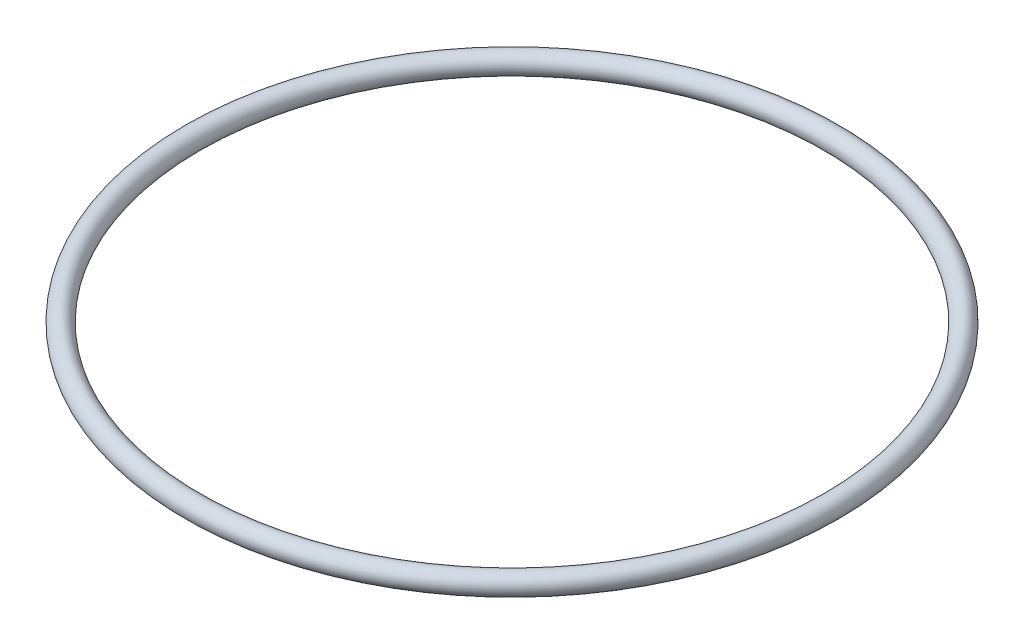
ISO-10303-21;
HEADER;
FILE_DESCRIPTION(('STEP AP214'),'2;1');
FILE_NAME('part.step','',(''),(''),'','','');
FILE_SCHEMA(('AUTOMOTIVE_DESIGN { 1 0 10303 214 1 1 1 1 }'));
ENDSEC;
DATA;
#1=APPLICATION_CONTEXT('core data for automotive mechanical design processes');
#2=APPLICATION_PROTOCOL_DEFINITION('international standard','automotive_design',2000,#1);
#3=PRODUCT_CONTEXT('',#1,'mechanical');
#4=PRODUCT('Part','Part','',(#3));
#5=PRODUCT_RELATED_PRODUCT_CATEGORY('part','',(#4));
#6=PRODUCT_DEFINITION_FORMATION('','',#4);
#7=PRODUCT_DEFINITION_CONTEXT('part definition',#1,'design');
#8=PRODUCT_DEFINITION('design','',#6,#7);
#9=PRODUCT_DEFINITION_SHAPE('','',#8);
#10=(LENGTH_UNIT() NAMED_UNIT(*) SI_UNIT(.MILLI.,.METRE.));
#11=(NAMED_UNIT(*) PLANE_ANGLE_UNIT() SI_UNIT($,.RADIAN.));
#12=(NAMED_UNIT(*) SI_UNIT($,.STERADIAN.) SOLID_ANGLE_UNIT());
#13=UNCERTAINTY_MEASURE_WITH_UNIT(LENGTH_MEASURE(1.E-05),#10,'distance_accuracy_value','');
#14=(GEOMETRIC_REPRESENTATION_CONTEXT(3) GLOBAL_UNCERTAINTY_ASSIGNED_CONTEXT((#13)) GLOBAL_UNIT_ASSIGNED_CONTEXT((#10,
#11,#12)) REPRESENTATION_CONTEXT('',''));
#15=CARTESIAN_POINT('',(0.,0.,0.));
#16=DIRECTION('',(0.,0.,1.));
#17=DIRECTION('',(1.,0.,0.));
#18=AXIS2_PLACEMENT_3D('',#15,#16,#17);
#19=CARTESIAN_POINT('',(0.,0.,0.));
#20=DIRECTION('',(0.,1.,0.));
#21=DIRECTION('',(0.,0.,1.));
#22=AXIS2_PLACEMENT_3D('',#19,#20,#21);
#23=TOROIDAL_SURFACE('',#22,46.25,1.5);
#24=CARTESIAN_POINT('',(46.25,0.,0.));
#25=DIRECTION('',(0.,0.,1.));
#26=DIRECTION('',(1.,0.,0.));
#27=AXIS2_PLACEMENT_3D('',#24,#25,#26);
#28=CIRCLE('',#27,1.5);
#29=CARTESIAN_POINT('',(47.75,0.,0.));
#30=VERTEX_POINT('',#29);
#31=EDGE_CURVE('E10',#30,#30,#28,.T.);
#32=CARTESIAN_POINT('',(0.,0.,0.));
#33=DIRECTION('',(0.,1.,0.));
#34=DIRECTION('',(0.,0.,1.));
#35=AXIS2_PLACEMENT_3D('',#32,#33,#34);
#36=CIRCLE('',#35,47.75);
#37=EDGE_CURVE('',#30,#30,#36,.T.);
#38=ORIENTED_EDGE('',*,*,#31,.F.);
#39=ORIENTED_EDGE('',*,*,#31,.T.);
#40=ORIENTED_EDGE('',*,*,#37,.T.);
#41=ORIENTED_EDGE('',*,*,#37,.F.);
#42=EDGE_LOOP('',(#38,#40,#39,#41));
#43=FACE_BOUND('',#42,.T.);
#44=ADVANCED_FACE('F39',(#43),#23,.T.);
#45=CLOSED_SHELL('',(#44));
#46=MANIFOLD_SOLID_BREP('B2',#45);
#47=ADVANCED_BREP_SHAPE_REPRESENTATION('',(#18,#46),#14);
#48=SHAPE_DEFINITION_REPRESENTATION(#9,#47);
ENDSEC;
END-ISO-10303-21;
